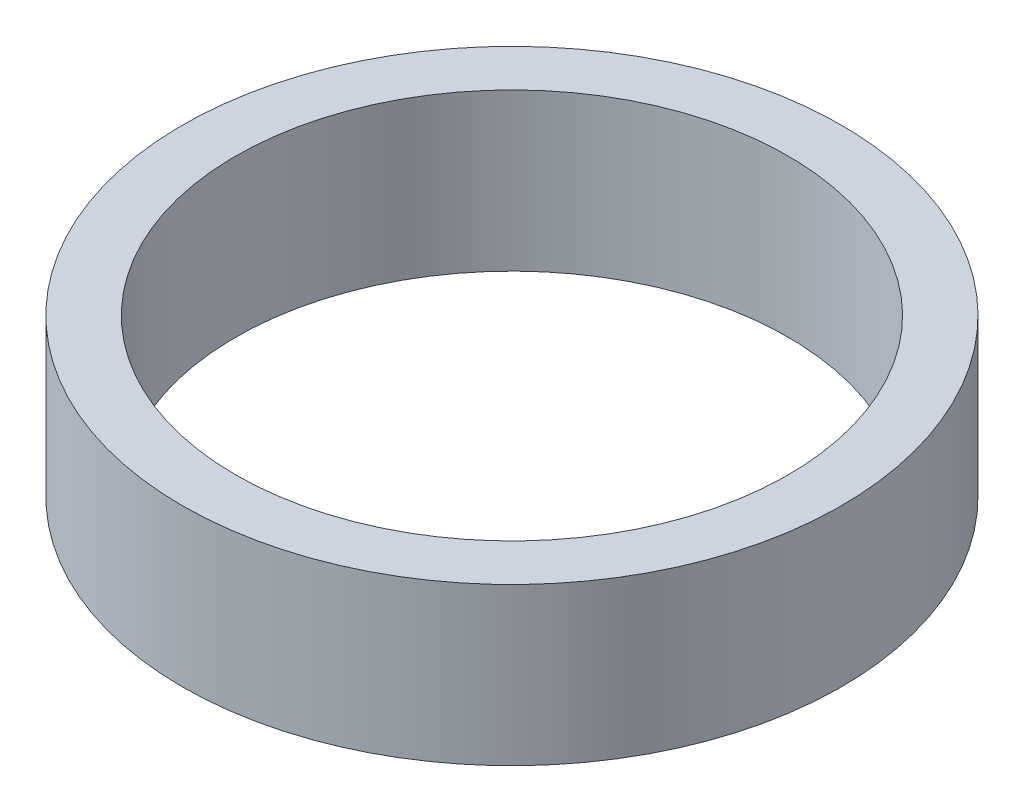
ISO-10303-21;
HEADER;
FILE_DESCRIPTION(('STEP AP214'),'2;1');
FILE_NAME('part.step','',(''),(''),'','','');
FILE_SCHEMA(('AUTOMOTIVE_DESIGN { 1 0 10303 214 1 1 1 1 }'));
ENDSEC;
DATA;
#1=APPLICATION_CONTEXT('core data for automotive mechanical design processes');
#2=APPLICATION_PROTOCOL_DEFINITION('international standard','automotive_design',2000,#1);
#3=PRODUCT_CONTEXT('',#1,'mechanical');
#4=PRODUCT('Part','Part','',(#3));
#5=PRODUCT_RELATED_PRODUCT_CATEGORY('part','',(#4));
#6=PRODUCT_DEFINITION_FORMATION('','',#4);
#7=PRODUCT_DEFINITION_CONTEXT('part definition',#1,'design');
#8=PRODUCT_DEFINITION('design','',#6,#7);
#9=PRODUCT_DEFINITION_SHAPE('','',#8);
#10=(LENGTH_UNIT() NAMED_UNIT(*) SI_UNIT(.MILLI.,.METRE.));
#11=(NAMED_UNIT(*) PLANE_ANGLE_UNIT() SI_UNIT($,.RADIAN.));
#12=(NAMED_UNIT(*) SI_UNIT($,.STERADIAN.) SOLID_ANGLE_UNIT());
#13=UNCERTAINTY_MEASURE_WITH_UNIT(LENGTH_MEASURE(1.E-05),#10,'distance_accuracy_value','');
#14=(GEOMETRIC_REPRESENTATION_CONTEXT(3) GLOBAL_UNCERTAINTY_ASSIGNED_CONTEXT((#13)) GLOBAL_UNIT_ASSIGNED_CONTEXT((#10,
#11,#12)) REPRESENTATION_CONTEXT('',''));
#15=CARTESIAN_POINT('',(0.,0.,0.));
#16=DIRECTION('',(0.,0.,1.));
#17=DIRECTION('',(1.,0.,0.));
#18=AXIS2_PLACEMENT_3D('',#15,#16,#17);
#19=CARTESIAN_POINT('',(0.,25.,0.));
#20=DIRECTION('',(0.,1.,0.));
#21=DIRECTION('',(0.,0.,1.));
#22=AXIS2_PLACEMENT_3D('',#19,#20,#21);
#23=PLANE('',#22);
#24=CARTESIAN_POINT('',(0.,25.,0.));
#25=DIRECTION('',(0.,1.,0.));
#26=DIRECTION('',(0.,0.,1.));
#27=AXIS2_PLACEMENT_3D('',#24,#25,#26);
#28=CIRCLE('',#27,44.);
#29=CARTESIAN_POINT('',(0.,25.,44.));
#30=VERTEX_POINT('',#29);
#31=EDGE_CURVE('E51',#30,#30,#28,.T.);
#32=ORIENTED_EDGE('',*,*,#31,.F.);
#33=EDGE_LOOP('',(#32));
#34=FACE_BOUND('',#33,.T.);
#35=CARTESIAN_POINT('',(0.,25.,0.));
#36=DIRECTION('',(0.,1.,0.));
#37=DIRECTION('',(0.,0.,1.));
#38=AXIS2_PLACEMENT_3D('',#35,#36,#37);
#39=CIRCLE('',#38,52.5);
#40=CARTESIAN_POINT('',(0.,25.,52.5));
#41=VERTEX_POINT('',#40);
#42=EDGE_CURVE('E10',#41,#41,#39,.T.);
#43=ORIENTED_EDGE('',*,*,#42,.T.);
#44=EDGE_LOOP('',(#43));
#45=FACE_BOUND('',#44,.T.);
#46=ADVANCED_FACE('F37',(#34,#45),#23,.T.);
#47=CARTESIAN_POINT('',(0.,0.,0.));
#48=DIRECTION('',(0.,1.,0.));
#49=DIRECTION('',(0.,0.,1.));
#50=AXIS2_PLACEMENT_3D('',#47,#48,#49);
#51=PLANE('',#50);
#52=CARTESIAN_POINT('',(0.,0.,0.));
#53=DIRECTION('',(0.,1.,0.));
#54=DIRECTION('',(0.,0.,1.));
#55=AXIS2_PLACEMENT_3D('',#52,#53,#54);
#56=CIRCLE('',#55,44.);
#57=CARTESIAN_POINT('',(0.,0.,44.));
#58=VERTEX_POINT('',#57);
#59=EDGE_CURVE('E41',#58,#58,#56,.T.);
#60=ORIENTED_EDGE('',*,*,#59,.T.);
#61=EDGE_LOOP('',(#60));
#62=FACE_BOUND('',#61,.T.);
#63=CARTESIAN_POINT('',(0.,0.,0.));
#64=DIRECTION('',(0.,1.,0.));
#65=DIRECTION('',(0.,0.,1.));
#66=AXIS2_PLACEMENT_3D('',#63,#64,#65);
#67=CIRCLE('',#66,52.5);
#68=CARTESIAN_POINT('',(0.,0.,52.5));
#69=VERTEX_POINT('',#68);
#70=EDGE_CURVE('E45',#69,#69,#67,.T.);
#71=ORIENTED_EDGE('',*,*,#70,.F.);
#72=EDGE_LOOP('',(#71));
#73=FACE_BOUND('',#72,.T.);
#74=ADVANCED_FACE('F58',(#62,#73),#51,.F.);
#75=CARTESIAN_POINT('',(0.,25.,0.));
#76=DIRECTION('',(0.,-1.,0.));
#77=DIRECTION('',(0.,0.,-1.));
#78=AXIS2_PLACEMENT_3D('',#75,#76,#77);
#79=CYLINDRICAL_SURFACE('',#78,52.5);
#80=ORIENTED_EDGE('',*,*,#42,.F.);
#81=EDGE_LOOP('',(#80));
#82=FACE_BOUND('',#81,.T.);
#83=ORIENTED_EDGE('',*,*,#70,.T.);
#84=EDGE_LOOP('',(#83));
#85=FACE_BOUND('',#84,.T.);
#86=ADVANCED_FACE('F39',(#82,#85),#79,.T.);
#87=CARTESIAN_POINT('',(0.,-5.,0.));
#88=DIRECTION('',(0.,1.,0.));
#89=DIRECTION('',(0.,0.,1.));
#90=AXIS2_PLACEMENT_3D('',#87,#88,#89);
#91=CYLINDRICAL_SURFACE('',#90,44.);
#92=ORIENTED_EDGE('',*,*,#31,.T.);
#93=EDGE_LOOP('',(#92));
#94=FACE_BOUND('',#93,.T.);
#95=ORIENTED_EDGE('',*,*,#59,.F.);
#96=EDGE_LOOP('',(#95));
#97=FACE_BOUND('',#96,.T.);
#98=ADVANCED_FACE('F61',(#94,#97),#91,.F.);
#99=CLOSED_SHELL('',(#46,#74,#86,#98));
#100=MANIFOLD_SOLID_BREP('B2',#99);
#101=ADVANCED_BREP_SHAPE_REPRESENTATION('',(#18,#100),#14);
#102=SHAPE_DEFINITION_REPRESENTATION(#9,#101);
ENDSEC;
END-ISO-10303-21;
